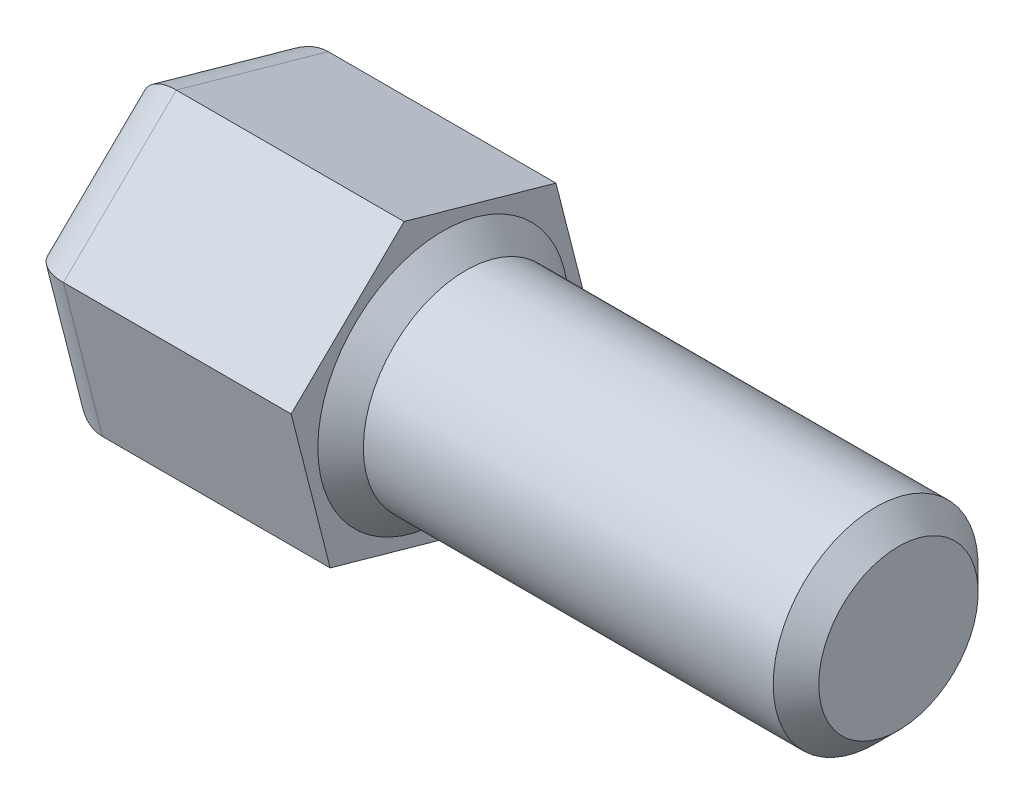
ISO-10303-21;
HEADER;
FILE_DESCRIPTION(('STEP AP214'),'2;1');
FILE_NAME('part.step','',(''),(''),'','','');
FILE_SCHEMA(('AUTOMOTIVE_DESIGN { 1 0 10303 214 1 1 1 1 }'));
ENDSEC;
DATA;
#1=APPLICATION_CONTEXT('core data for automotive mechanical design processes');
#2=APPLICATION_PROTOCOL_DEFINITION('international standard','automotive_design',2000,#1);
#3=PRODUCT_CONTEXT('',#1,'mechanical');
#4=PRODUCT('Part','Part','',(#3));
#5=PRODUCT_RELATED_PRODUCT_CATEGORY('part','',(#4));
#6=PRODUCT_DEFINITION_FORMATION('','',#4);
#7=PRODUCT_DEFINITION_CONTEXT('part definition',#1,'design');
#8=PRODUCT_DEFINITION('design','',#6,#7);
#9=PRODUCT_DEFINITION_SHAPE('','',#8);
#10=(LENGTH_UNIT() NAMED_UNIT(*) SI_UNIT(.MILLI.,.METRE.));
#11=(NAMED_UNIT(*) PLANE_ANGLE_UNIT() SI_UNIT($,.RADIAN.));
#12=(NAMED_UNIT(*) SI_UNIT($,.STERADIAN.) SOLID_ANGLE_UNIT());
#13=UNCERTAINTY_MEASURE_WITH_UNIT(LENGTH_MEASURE(1.E-05),#10,'distance_accuracy_value','');
#14=(GEOMETRIC_REPRESENTATION_CONTEXT(3) GLOBAL_UNCERTAINTY_ASSIGNED_CONTEXT((#13)) GLOBAL_UNIT_ASSIGNED_CONTEXT((#10,
#11,#12)) REPRESENTATION_CONTEXT('',''));
#15=CARTESIAN_POINT('',(0.,0.,0.));
#16=DIRECTION('',(0.,0.,1.));
#17=DIRECTION('',(1.,0.,0.));
#18=AXIS2_PLACEMENT_3D('',#15,#16,#17);
#19=CARTESIAN_POINT('',(0.,0.,0.));
#20=DIRECTION('',(-1.,0.,0.));
#21=DIRECTION('',(0.,0.,1.));
#22=AXIS2_PLACEMENT_3D('',#19,#20,#21);
#23=CYLINDRICAL_SURFACE('',#22,4.5);
#24=CARTESIAN_POINT('',(19.,0.,0.));
#25=DIRECTION('',(-1.,0.,0.));
#26=DIRECTION('',(0.,0.,1.));
#27=AXIS2_PLACEMENT_3D('',#24,#25,#26);
#28=CIRCLE('',#27,4.5);
#29=CARTESIAN_POINT('',(19.,0.,4.5));
#30=VERTEX_POINT('',#29);
#31=EDGE_CURVE('E191',#30,#30,#28,.T.);
#32=ORIENTED_EDGE('',*,*,#31,.T.);
#33=EDGE_LOOP('',(#32));
#34=FACE_BOUND('',#33,.T.);
#35=CARTESIAN_POINT('',(0.999999999999997,0.,0.));
#36=DIRECTION('',(-1.,0.,0.));
#37=DIRECTION('',(0.,0.,1.));
#38=AXIS2_PLACEMENT_3D('',#35,#36,#37);
#39=CIRCLE('',#38,4.5);
#40=CARTESIAN_POINT('',(0.999999999999997,0.,4.5));
#41=VERTEX_POINT('',#40);
#42=EDGE_CURVE('E176',#41,#41,#39,.F.);
#43=ORIENTED_EDGE('',*,*,#42,.T.);
#44=EDGE_LOOP('',(#43));
#45=FACE_BOUND('',#44,.T.);
#46=ADVANCED_FACE('F36',(#34,#45),#23,.T.);
#47=CARTESIAN_POINT('',(20.,0.,0.));
#48=DIRECTION('',(-1.,0.,0.));
#49=DIRECTION('',(0.,0.,1.));
#50=AXIS2_PLACEMENT_3D('',#47,#48,#49);
#51=PLANE('',#50);
#52=CARTESIAN_POINT('',(20.,0.,0.));
#53=DIRECTION('',(-1.,0.,0.));
#54=DIRECTION('',(0.,0.,1.));
#55=AXIS2_PLACEMENT_3D('',#52,#53,#54);
#56=CIRCLE('',#55,3.49999999999999);
#57=CARTESIAN_POINT('',(20.,0.,3.49999999999999));
#58=VERTEX_POINT('',#57);
#59=EDGE_CURVE('E44',#58,#58,#56,.F.);
#60=ORIENTED_EDGE('',*,*,#59,.T.);
#61=EDGE_LOOP('',(#60));
#62=FACE_BOUND('',#61,.T.);
#63=ADVANCED_FACE('F196',(#62),#51,.F.);
#64=CARTESIAN_POINT('',(-12.,1.87310276482664,6.67019385268515));
#65=DIRECTION('',(0.,-0.715517622652675,-0.698594683399082));
#66=DIRECTION('',(0.,0.698594683399082,-0.715517622652675));
#67=AXIS2_PLACEMENT_3D('',#64,#65,#66);
#68=PLANE('',#67);
#69=DIRECTION('',(1.,0.,0.));
#70=VECTOR('',#69,1.);
#71=CARTESIAN_POINT('',(-12.,6.71310870700546,1.71294234810383));
#72=LINE('',#71,#70);
#73=CARTESIAN_POINT('',(-10.,6.71310870700546,1.71294234810383));
#74=VERTEX_POINT('',#73);
#75=CARTESIAN_POINT('',(0.,6.71310870700546,1.71294234810383));
#76=VERTEX_POINT('',#75);
#77=EDGE_CURVE('E106',#74,#76,#72,.T.);
#78=ORIENTED_EDGE('',*,*,#77,.F.);
#79=DIRECTION('',(0.,0.698594683399082,-0.715517622652675));
#80=VECTOR('',#79,1.);
#81=CARTESIAN_POINT('',(-10.,1.87310276482664,6.67019385268515));
#82=LINE('',#81,#80);
#83=CARTESIAN_POINT('',(-10.,1.87310276482664,6.67019385268515));
#84=VERTEX_POINT('',#83);
#85=EDGE_CURVE('E172',#74,#84,#82,.F.);
#86=ORIENTED_EDGE('',*,*,#85,.T.);
#87=DIRECTION('',(1.,0.,0.));
#88=VECTOR('',#87,1.);
#89=CARTESIAN_POINT('',(-12.,1.87310276482664,6.67019385268515));
#90=LINE('',#89,#88);
#91=CARTESIAN_POINT('',(0.,1.87310276482664,6.67019385268515));
#92=VERTEX_POINT('',#91);
#93=EDGE_CURVE('E128',#84,#92,#90,.T.);
#94=ORIENTED_EDGE('',*,*,#93,.T.);
#95=DIRECTION('',(0.,0.698594683399082,-0.715517622652675));
#96=VECTOR('',#95,1.);
#97=CARTESIAN_POINT('',(0.,1.87310276482664,6.67019385268515));
#98=LINE('',#97,#96);
#99=EDGE_CURVE('E121',#92,#76,#98,.T.);
#100=ORIENTED_EDGE('',*,*,#99,.T.);
#101=EDGE_LOOP('',(#78,#86,#94,#100));
#102=FACE_BOUND('',#101,.T.);
#103=ADVANCED_FACE('F126',(#102),#68,.F.);
#104=CARTESIAN_POINT('',(-12.,6.71310870700546,1.71294234810383));
#105=DIRECTION('',(0.,-0.96275955409869,0.270359096373124));
#106=DIRECTION('',(0.,-0.270359096373124,-0.96275955409869));
#107=AXIS2_PLACEMENT_3D('',#104,#105,#106);
#108=PLANE('',#107);
#109=DIRECTION('',(1.,0.,0.));
#110=VECTOR('',#109,1.);
#111=CARTESIAN_POINT('',(-12.,4.84000594217882,-4.95725150458132));
#112=LINE('',#111,#110);
#113=CARTESIAN_POINT('',(-10.,4.84000594217882,-4.95725150458132));
#114=VERTEX_POINT('',#113);
#115=CARTESIAN_POINT('',(0.,4.84000594217882,-4.95725150458132));
#116=VERTEX_POINT('',#115);
#117=EDGE_CURVE('E115',#114,#116,#112,.T.);
#118=ORIENTED_EDGE('',*,*,#117,.F.);
#119=DIRECTION('',(0.,-0.270359096373124,-0.96275955409869));
#120=VECTOR('',#119,1.);
#121=CARTESIAN_POINT('',(-10.,6.71310870700546,1.71294234810383));
#122=LINE('',#121,#120);
#123=EDGE_CURVE('E58',#114,#74,#122,.F.);
#124=ORIENTED_EDGE('',*,*,#123,.T.);
#125=ORIENTED_EDGE('',*,*,#77,.T.);
#126=DIRECTION('',(0.,-0.270359096373124,-0.96275955409869));
#127=VECTOR('',#126,1.);
#128=CARTESIAN_POINT('',(0.,6.71310870700546,1.71294234810383));
#129=LINE('',#128,#127);
#130=EDGE_CURVE('E109',#76,#116,#129,.T.);
#131=ORIENTED_EDGE('',*,*,#130,.T.);
#132=EDGE_LOOP('',(#118,#124,#125,#131));
#133=FACE_BOUND('',#132,.T.);
#134=ADVANCED_FACE('F108',(#133),#108,.F.);
#135=CARTESIAN_POINT('',(-12.,4.84000594217882,-4.95725150458132));
#136=DIRECTION('',(0.,-0.247241931446014,0.968953779772206));
#137=DIRECTION('',(0.,-0.968953779772206,-0.247241931446014));
#138=AXIS2_PLACEMENT_3D('',#135,#136,#137);
#139=PLANE('',#138);
#140=DIRECTION('',(1.,0.,0.));
#141=VECTOR('',#140,1.);
#142=CARTESIAN_POINT('',(-12.,-1.87310276482665,-6.67019385268515));
#143=LINE('',#142,#141);
#144=CARTESIAN_POINT('',(-10.,-1.87310276482665,-6.67019385268515));
#145=VERTEX_POINT('',#144);
#146=CARTESIAN_POINT('',(0.,-1.87310276482665,-6.67019385268515));
#147=VERTEX_POINT('',#146);
#148=EDGE_CURVE('E150',#145,#147,#143,.T.);
#149=ORIENTED_EDGE('',*,*,#148,.F.);
#150=DIRECTION('',(0.,-0.968953779772206,-0.247241931446014));
#151=VECTOR('',#150,1.);
#152=CARTESIAN_POINT('',(-10.,4.84000594217882,-4.95725150458132));
#153=LINE('',#152,#151);
#154=EDGE_CURVE('E51',#145,#114,#153,.F.);
#155=ORIENTED_EDGE('',*,*,#154,.T.);
#156=ORIENTED_EDGE('',*,*,#117,.T.);
#157=DIRECTION('',(0.,-0.968953779772206,-0.247241931446014));
#158=VECTOR('',#157,1.);
#159=CARTESIAN_POINT('',(0.,4.84000594217882,-4.95725150458132));
#160=LINE('',#159,#158);
#161=EDGE_CURVE('E124',#116,#147,#160,.T.);
#162=ORIENTED_EDGE('',*,*,#161,.T.);
#163=EDGE_LOOP('',(#149,#155,#156,#162));
#164=FACE_BOUND('',#163,.T.);
#165=ADVANCED_FACE('F238',(#164),#139,.F.);
#166=CARTESIAN_POINT('',(-12.,-1.87310276482665,-6.67019385268515));
#167=DIRECTION('',(0.,0.715517622652675,0.698594683399082));
#168=DIRECTION('',(0.,-0.698594683399082,0.715517622652676));
#169=AXIS2_PLACEMENT_3D('',#166,#167,#168);
#170=PLANE('',#169);
#171=DIRECTION('',(1.,0.,0.));
#172=VECTOR('',#171,1.);
#173=CARTESIAN_POINT('',(-12.,-6.71310870700546,-1.71294234810383));
#174=LINE('',#173,#172);
#175=CARTESIAN_POINT('',(-10.,-6.71310870700546,-1.71294234810383));
#176=VERTEX_POINT('',#175);
#177=CARTESIAN_POINT('',(0.,-6.71310870700546,-1.71294234810383));
#178=VERTEX_POINT('',#177);
#179=EDGE_CURVE('E148',#176,#178,#174,.T.);
#180=ORIENTED_EDGE('',*,*,#179,.F.);
#181=DIRECTION('',(0.,-0.698594683399082,0.715517622652676));
#182=VECTOR('',#181,1.);
#183=CARTESIAN_POINT('',(-10.,-1.87310276482665,-6.67019385268515));
#184=LINE('',#183,#182);
#185=EDGE_CURVE('E165',#176,#145,#184,.F.);
#186=ORIENTED_EDGE('',*,*,#185,.T.);
#187=ORIENTED_EDGE('',*,*,#148,.T.);
#188=DIRECTION('',(0.,-0.698594683399082,0.715517622652676));
#189=VECTOR('',#188,1.);
#190=CARTESIAN_POINT('',(0.,-1.87310276482665,-6.67019385268515));
#191=LINE('',#190,#189);
#192=EDGE_CURVE('E137',#147,#178,#191,.T.);
#193=ORIENTED_EDGE('',*,*,#192,.T.);
#194=EDGE_LOOP('',(#180,#186,#187,#193));
#195=FACE_BOUND('',#194,.T.);
#196=ADVANCED_FACE('F234',(#195),#170,.F.);
#197=CARTESIAN_POINT('',(-12.,-6.71310870700546,-1.71294234810383));
#198=DIRECTION('',(0.,0.96275955409869,-0.270359096373124));
#199=DIRECTION('',(0.,0.270359096373124,0.96275955409869));
#200=AXIS2_PLACEMENT_3D('',#197,#198,#199);
#201=PLANE('',#200);
#202=DIRECTION('',(1.,0.,0.));
#203=VECTOR('',#202,1.);
#204=CARTESIAN_POINT('',(-12.,-4.84000594217882,4.95725150458132));
#205=LINE('',#204,#203);
#206=CARTESIAN_POINT('',(-10.,-4.84000594217882,4.95725150458132));
#207=VERTEX_POINT('',#206);
#208=CARTESIAN_POINT('',(0.,-4.84000594217882,4.95725150458132));
#209=VERTEX_POINT('',#208);
#210=EDGE_CURVE('E146',#207,#209,#205,.T.);
#211=ORIENTED_EDGE('',*,*,#210,.F.);
#212=DIRECTION('',(0.,0.270359096373124,0.96275955409869));
#213=VECTOR('',#212,1.);
#214=CARTESIAN_POINT('',(-10.,-6.71310870700546,-1.71294234810383));
#215=LINE('',#214,#213);
#216=EDGE_CURVE('E168',#207,#176,#215,.F.);
#217=ORIENTED_EDGE('',*,*,#216,.T.);
#218=ORIENTED_EDGE('',*,*,#179,.T.);
#219=DIRECTION('',(0.,0.270359096373124,0.96275955409869));
#220=VECTOR('',#219,1.);
#221=CARTESIAN_POINT('',(0.,-6.71310870700546,-1.71294234810383));
#222=LINE('',#221,#220);
#223=EDGE_CURVE('E140',#178,#209,#222,.T.);
#224=ORIENTED_EDGE('',*,*,#223,.T.);
#225=EDGE_LOOP('',(#211,#217,#218,#224));
#226=FACE_BOUND('',#225,.T.);
#227=ADVANCED_FACE('F230',(#226),#201,.F.);
#228=CARTESIAN_POINT('',(-12.,-4.84000594217882,4.95725150458132));
#229=DIRECTION('',(0.,0.247241931446014,-0.968953779772206));
#230=DIRECTION('',(0.,0.968953779772206,0.247241931446014));
#231=AXIS2_PLACEMENT_3D('',#228,#229,#230);
#232=PLANE('',#231);
#233=ORIENTED_EDGE('',*,*,#93,.F.);
#234=DIRECTION('',(0.,0.968953779772206,0.247241931446014));
#235=VECTOR('',#234,1.);
#236=CARTESIAN_POINT('',(-10.,-4.84000594217882,4.95725150458132));
#237=LINE('',#236,#235);
#238=EDGE_CURVE('E170',#84,#207,#237,.F.);
#239=ORIENTED_EDGE('',*,*,#238,.T.);
#240=ORIENTED_EDGE('',*,*,#210,.T.);
#241=DIRECTION('',(0.,0.968953779772206,0.247241931446014));
#242=VECTOR('',#241,1.);
#243=CARTESIAN_POINT('',(0.,-4.84000594217882,4.95725150458132));
#244=LINE('',#243,#242);
#245=EDGE_CURVE('E143',#209,#92,#244,.T.);
#246=ORIENTED_EDGE('',*,*,#245,.T.);
#247=EDGE_LOOP('',(#233,#239,#240,#246));
#248=FACE_BOUND('',#247,.T.);
#249=ADVANCED_FACE('F224',(#248),#232,.F.);
#250=CARTESIAN_POINT('',(-12.,0.,0.));
#251=DIRECTION('',(-1.,0.,0.));
#252=DIRECTION('',(0.,0.,1.));
#253=AXIS2_PLACEMENT_3D('',#250,#251,#252);
#254=PLANE('',#253);
#255=DIRECTION('',(0.,-0.968953779772206,-0.247241931446014));
#256=VECTOR('',#255,1.);
#257=CARTESIAN_POINT('',(-12.,-2.36758662771868,-4.73228629314074));
#258=LINE('',#257,#256);
#259=CARTESIAN_POINT('',(-12.,3.22667062811921,-3.30483433638754));
#260=VERTEX_POINT('',#259);
#261=CARTESIAN_POINT('',(-12.,-1.2487351765511,-4.4467959017901));
#262=VERTEX_POINT('',#261);
#263=EDGE_CURVE('E154',#260,#262,#258,.T.);
#264=ORIENTED_EDGE('',*,*,#263,.T.);
#265=DIRECTION('',(0.,-0.698594683399082,0.715517622652676));
#266=VECTOR('',#265,1.);
#267=CARTESIAN_POINT('',(-12.,-5.28207346170011,-0.315752981305664));
#268=LINE('',#267,#266);
#269=CARTESIAN_POINT('',(-12.,-4.47540580467031,-1.14196156540255));
#270=VERTEX_POINT('',#269);
#271=EDGE_CURVE('E162',#262,#270,#268,.T.);
#272=ORIENTED_EDGE('',*,*,#271,.T.);
#273=DIRECTION('',(0.,0.270359096373124,0.96275955409869));
#274=VECTOR('',#273,1.);
#275=CARTESIAN_POINT('',(-12.,-2.91448683398144,4.41653331183507));
#276=LINE('',#275,#274);
#277=CARTESIAN_POINT('',(-12.,-3.22667062811922,3.30483433638755));
#278=VERTEX_POINT('',#277);
#279=EDGE_CURVE('E160',#270,#278,#276,.T.);
#280=ORIENTED_EDGE('',*,*,#279,.T.);
#281=DIRECTION('',(0.,0.968953779772206,0.247241931446014));
#282=VECTOR('',#281,1.);
#283=CARTESIAN_POINT('',(-12.,2.36758662771867,4.73228629314074));
#284=LINE('',#283,#282);
#285=CARTESIAN_POINT('',(-12.,1.24873517655109,4.4467959017901));
#286=VERTEX_POINT('',#285);
#287=EDGE_CURVE('E158',#278,#286,#284,.T.);
#288=ORIENTED_EDGE('',*,*,#287,.T.);
#289=DIRECTION('',(0.,0.698594683399082,-0.715517622652675));
#290=VECTOR('',#289,1.);
#291=CARTESIAN_POINT('',(-12.,5.28207346170011,0.315752981305669));
#292=LINE('',#291,#290);
#293=CARTESIAN_POINT('',(-12.,4.47540580467031,1.14196156540256));
#294=VERTEX_POINT('',#293);
#295=EDGE_CURVE('E156',#286,#294,#292,.T.);
#296=ORIENTED_EDGE('',*,*,#295,.T.);
#297=DIRECTION('',(0.,-0.270359096373124,-0.96275955409869));
#298=VECTOR('',#297,1.);
#299=CARTESIAN_POINT('',(-12.,2.91448683398144,-4.41653331183507));
#300=LINE('',#299,#298);
#301=EDGE_CURVE('E114',#294,#260,#300,.T.);
#302=ORIENTED_EDGE('',*,*,#301,.T.);
#303=EDGE_LOOP('',(#264,#272,#280,#288,#296,#302));
#304=FACE_BOUND('',#303,.T.);
#305=ADVANCED_FACE('F215',(#304),#254,.T.);
#306=CARTESIAN_POINT('',(0.,0.,0.));
#307=DIRECTION('',(-1.,0.,0.));
#308=DIRECTION('',(0.,0.,1.));
#309=AXIS2_PLACEMENT_3D('',#306,#307,#308);
#310=PLANE('',#309);
#311=CARTESIAN_POINT('',(0.,0.,0.));
#312=DIRECTION('',(-1.,0.,0.));
#313=DIRECTION('',(0.,0.,1.));
#314=AXIS2_PLACEMENT_3D('',#311,#312,#313);
#315=CIRCLE('',#314,5.50000000000001);
#316=CARTESIAN_POINT('',(0.,0.,5.50000000000001));
#317=VERTEX_POINT('',#316);
#318=EDGE_CURVE('E11',#317,#317,#315,.T.);
#319=ORIENTED_EDGE('',*,*,#318,.T.);
#320=EDGE_LOOP('',(#319));
#321=FACE_BOUND('',#320,.T.);
#322=ORIENTED_EDGE('',*,*,#99,.F.);
#323=ORIENTED_EDGE('',*,*,#245,.F.);
#324=ORIENTED_EDGE('',*,*,#223,.F.);
#325=ORIENTED_EDGE('',*,*,#192,.F.);
#326=ORIENTED_EDGE('',*,*,#161,.F.);
#327=ORIENTED_EDGE('',*,*,#130,.F.);
#328=EDGE_LOOP('',(#322,#323,#324,#325,#326,#327));
#329=FACE_BOUND('',#328,.T.);
#330=ADVANCED_FACE('F119',(#321,#329),#310,.F.);
#331=CARTESIAN_POINT('',(-10.,2.8620704906107,2.79437873359633));
#332=DIRECTION('',(0.,-0.698594683399082,0.715517622652675));
#333=DIRECTION('',(0.,-0.715517622652675,-0.698594683399082));
#334=AXIS2_PLACEMENT_3D('',#331,#332,#333);
#335=CYLINDRICAL_SURFACE('',#334,2.);
#336=CARTESIAN_POINT('',(-10.,1.2487351765511,4.4467959017901));
#337=DIRECTION('',(0.,-0.96275955409869,0.270359096373124));
#338=DIRECTION('',(0.,0.270359096373124,0.96275955409869));
#339=AXIS2_PLACEMENT_3D('',#336,#337,#338);
#340=ELLIPSE('',#339,2.3094010767585,2.);
#341=EDGE_CURVE('E133',#84,#286,#340,.T.);
#342=ORIENTED_EDGE('',*,*,#341,.F.);
#343=ORIENTED_EDGE('',*,*,#85,.F.);
#344=CARTESIAN_POINT('',(-10.,4.47540580467031,1.14196156540256));
#345=DIRECTION('',(0.,-0.247241931446014,0.968953779772206));
#346=DIRECTION('',(0.,0.968953779772206,0.247241931446015));
#347=AXIS2_PLACEMENT_3D('',#344,#345,#346);
#348=ELLIPSE('',#347,2.3094010767585,2.);
#349=EDGE_CURVE('E130',#294,#74,#348,.F.);
#350=ORIENTED_EDGE('',*,*,#349,.F.);
#351=ORIENTED_EDGE('',*,*,#295,.F.);
#352=EDGE_LOOP('',(#342,#343,#350,#351));
#353=FACE_BOUND('',#352,.T.);
#354=ADVANCED_FACE('F214',(#353),#335,.T.);
#355=CARTESIAN_POINT('',(-10.,3.85103821639476,-1.08143638549249));
#356=DIRECTION('',(0.,0.270359096373124,0.96275955409869));
#357=DIRECTION('',(0.,-0.96275955409869,0.270359096373124));
#358=AXIS2_PLACEMENT_3D('',#355,#356,#357);
#359=CYLINDRICAL_SURFACE('',#358,2.);
#360=ORIENTED_EDGE('',*,*,#349,.T.);
#361=ORIENTED_EDGE('',*,*,#123,.F.);
#362=CARTESIAN_POINT('',(-10.,3.22667062811921,-3.30483433638754));
#363=DIRECTION('',(0.,0.715517622652675,0.698594683399082));
#364=DIRECTION('',(0.,-0.698594683399082,0.715517622652675));
#365=AXIS2_PLACEMENT_3D('',#362,#363,#364);
#366=ELLIPSE('',#365,2.3094010767585,2.);
#367=EDGE_CURVE('E184',#260,#114,#366,.F.);
#368=ORIENTED_EDGE('',*,*,#367,.F.);
#369=ORIENTED_EDGE('',*,*,#301,.F.);
#370=EDGE_LOOP('',(#360,#361,#368,#369));
#371=FACE_BOUND('',#370,.T.);
#372=ADVANCED_FACE('F221',(#371),#359,.T.);
#373=CARTESIAN_POINT('',(-10.,-0.988967725784057,3.87581511908882));
#374=DIRECTION('',(0.,-0.968953779772206,-0.247241931446014));
#375=DIRECTION('',(0.,0.247241931446014,-0.968953779772206));
#376=AXIS2_PLACEMENT_3D('',#373,#374,#375);
#377=CYLINDRICAL_SURFACE('',#376,2.);
#378=ORIENTED_EDGE('',*,*,#341,.T.);
#379=ORIENTED_EDGE('',*,*,#287,.F.);
#380=CARTESIAN_POINT('',(-10.,-3.22667062811922,3.30483433638755));
#381=DIRECTION('',(0.,-0.715517622652675,-0.698594683399082));
#382=DIRECTION('',(0.,-0.698594683399082,0.715517622652675));
#383=AXIS2_PLACEMENT_3D('',#380,#381,#382);
#384=ELLIPSE('',#383,2.3094010767585,2.);
#385=EDGE_CURVE('E181',#207,#278,#384,.T.);
#386=ORIENTED_EDGE('',*,*,#385,.F.);
#387=ORIENTED_EDGE('',*,*,#238,.F.);
#388=EDGE_LOOP('',(#378,#379,#386,#387));
#389=FACE_BOUND('',#388,.T.);
#390=ADVANCED_FACE('F258',(#389),#377,.T.);
#391=CARTESIAN_POINT('',(-10.,0.988967725784056,-3.87581511908882));
#392=DIRECTION('',(0.,0.968953779772206,0.247241931446014));
#393=DIRECTION('',(0.,-0.247241931446014,0.968953779772206));
#394=AXIS2_PLACEMENT_3D('',#391,#392,#393);
#395=CYLINDRICAL_SURFACE('',#394,2.);
#396=ORIENTED_EDGE('',*,*,#367,.T.);
#397=ORIENTED_EDGE('',*,*,#154,.F.);
#398=CARTESIAN_POINT('',(-10.,-1.2487351765511,-4.4467959017901));
#399=DIRECTION('',(0.,0.96275955409869,-0.270359096373124));
#400=DIRECTION('',(0.,0.270359096373124,0.96275955409869));
#401=AXIS2_PLACEMENT_3D('',#398,#399,#400);
#402=ELLIPSE('',#401,2.3094010767585,2.);
#403=EDGE_CURVE('E179',#262,#145,#402,.F.);
#404=ORIENTED_EDGE('',*,*,#403,.F.);
#405=ORIENTED_EDGE('',*,*,#263,.F.);
#406=EDGE_LOOP('',(#396,#397,#404,#405));
#407=FACE_BOUND('',#406,.T.);
#408=ADVANCED_FACE('F254',(#407),#395,.T.);
#409=CARTESIAN_POINT('',(-10.,-3.85103821639476,1.0814363854925));
#410=DIRECTION('',(0.,-0.270359096373124,-0.96275955409869));
#411=DIRECTION('',(0.,0.96275955409869,-0.270359096373124));
#412=AXIS2_PLACEMENT_3D('',#409,#410,#411);
#413=CYLINDRICAL_SURFACE('',#412,2.);
#414=ORIENTED_EDGE('',*,*,#385,.T.);
#415=ORIENTED_EDGE('',*,*,#279,.F.);
#416=CARTESIAN_POINT('',(-10.,-4.47540580467031,-1.14196156540255));
#417=DIRECTION('',(0.,0.247241931446014,-0.968953779772206));
#418=DIRECTION('',(0.,-0.968953779772206,-0.247241931446014));
#419=AXIS2_PLACEMENT_3D('',#416,#417,#418);
#420=ELLIPSE('',#419,2.3094010767585,2.);
#421=EDGE_CURVE('E177',#176,#270,#420,.T.);
#422=ORIENTED_EDGE('',*,*,#421,.F.);
#423=ORIENTED_EDGE('',*,*,#216,.F.);
#424=EDGE_LOOP('',(#414,#415,#422,#423));
#425=FACE_BOUND('',#424,.T.);
#426=ADVANCED_FACE('F250',(#425),#413,.T.);
#427=CARTESIAN_POINT('',(-10.,-2.8620704906107,-2.79437873359633));
#428=DIRECTION('',(0.,0.698594683399082,-0.715517622652676));
#429=DIRECTION('',(0.,0.715517622652676,0.698594683399082));
#430=AXIS2_PLACEMENT_3D('',#427,#428,#429);
#431=CYLINDRICAL_SURFACE('',#430,2.);
#432=ORIENTED_EDGE('',*,*,#403,.T.);
#433=ORIENTED_EDGE('',*,*,#185,.F.);
#434=ORIENTED_EDGE('',*,*,#421,.T.);
#435=ORIENTED_EDGE('',*,*,#271,.F.);
#436=EDGE_LOOP('',(#432,#433,#434,#435));
#437=FACE_BOUND('',#436,.T.);
#438=ADVANCED_FACE('F201',(#437),#431,.T.);
#439=CARTESIAN_POINT('',(19.,0.,0.));
#440=DIRECTION('',(-1.,0.,0.));
#441=DIRECTION('',(0.,0.,1.));
#442=AXIS2_PLACEMENT_3D('',#439,#440,#441);
#443=CONICAL_SURFACE('',#442,4.5,0.78539816339745);
#444=ORIENTED_EDGE('',*,*,#59,.F.);
#445=EDGE_LOOP('',(#444));
#446=FACE_BOUND('',#445,.T.);
#447=ORIENTED_EDGE('',*,*,#31,.F.);
#448=EDGE_LOOP('',(#447));
#449=FACE_BOUND('',#448,.T.);
#450=ADVANCED_FACE('F198',(#446,#449),#443,.T.);
#451=CARTESIAN_POINT('',(0.,0.,0.));
#452=DIRECTION('',(-1.,0.,0.));
#453=DIRECTION('',(0.,0.,1.));
#454=AXIS2_PLACEMENT_3D('',#451,#452,#453);
#455=CONICAL_SURFACE('',#454,5.50000000000001,0.785398163397453);
#456=ORIENTED_EDGE('',*,*,#42,.F.);
#457=EDGE_LOOP('',(#456));
#458=FACE_BOUND('',#457,.T.);
#459=ORIENTED_EDGE('',*,*,#318,.F.);
#460=EDGE_LOOP('',(#459));
#461=FACE_BOUND('',#460,.T.);
#462=ADVANCED_FACE('F38',(#458,#461),#455,.T.);
#463=CLOSED_SHELL('',(#46,#63,#103,#134,#165,#196,#227,#249,#305,#330,#354,#372,#390,#408,#426,
#438,#450,#462));
#464=MANIFOLD_SOLID_BREP('B2',#463);
#465=ADVANCED_BREP_SHAPE_REPRESENTATION('',(#18,#464),#14);
#466=SHAPE_DEFINITION_REPRESENTATION(#9,#465);
ENDSEC;
END-ISO-10303-21;
